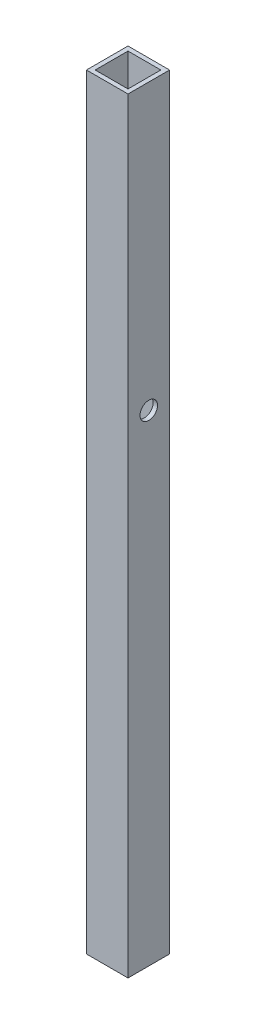
ISO-10303-21;
HEADER;
FILE_DESCRIPTION(('STEP AP214'),'2;1');
FILE_NAME('part.step','',(''),(''),'','','');
FILE_SCHEMA(('AUTOMOTIVE_DESIGN { 1 0 10303 214 1 1 1 1 }'));
ENDSEC;
DATA;
#1=APPLICATION_CONTEXT('core data for automotive mechanical design processes');
#2=APPLICATION_PROTOCOL_DEFINITION('international standard','automotive_design',2000,#1);
#3=PRODUCT_CONTEXT('',#1,'mechanical');
#4=PRODUCT('Part','Part','',(#3));
#5=PRODUCT_RELATED_PRODUCT_CATEGORY('part','',(#4));
#6=PRODUCT_DEFINITION_FORMATION('','',#4);
#7=PRODUCT_DEFINITION_CONTEXT('part definition',#1,'design');
#8=PRODUCT_DEFINITION('design','',#6,#7);
#9=PRODUCT_DEFINITION_SHAPE('','',#8);
#10=(LENGTH_UNIT() NAMED_UNIT(*) SI_UNIT(.MILLI.,.METRE.));
#11=(NAMED_UNIT(*) PLANE_ANGLE_UNIT() SI_UNIT($,.RADIAN.));
#12=(NAMED_UNIT(*) SI_UNIT($,.STERADIAN.) SOLID_ANGLE_UNIT());
#13=UNCERTAINTY_MEASURE_WITH_UNIT(LENGTH_MEASURE(1.E-05),#10,'distance_accuracy_value','');
#14=(GEOMETRIC_REPRESENTATION_CONTEXT(3) GLOBAL_UNCERTAINTY_ASSIGNED_CONTEXT((#13)) GLOBAL_UNIT_ASSIGNED_CONTEXT((#10,
#11,#12)) REPRESENTATION_CONTEXT('',''));
#15=CARTESIAN_POINT('',(0.,0.,0.));
#16=DIRECTION('',(0.,0.,1.));
#17=DIRECTION('',(1.,0.,0.));
#18=AXIS2_PLACEMENT_3D('',#15,#16,#17);
#19=CARTESIAN_POINT('',(0.,350.,0.));
#20=DIRECTION('',(0.,1.,0.));
#21=DIRECTION('',(0.,0.,1.));
#22=AXIS2_PLACEMENT_3D('',#19,#20,#21);
#23=PLANE('',#22);
#24=DIRECTION('',(0.,0.,-1.));
#25=VECTOR('',#24,1.);
#26=CARTESIAN_POINT('',(9.5,350.,9.5));
#27=LINE('',#26,#25);
#28=CARTESIAN_POINT('',(9.5,350.,9.5));
#29=VERTEX_POINT('',#28);
#30=CARTESIAN_POINT('',(9.5,350.,-9.5));
#31=VERTEX_POINT('',#30);
#32=EDGE_CURVE('E163',#29,#31,#27,.T.);
#33=ORIENTED_EDGE('',*,*,#32,.T.);
#34=DIRECTION('',(-1.,0.,0.));
#35=VECTOR('',#34,1.);
#36=CARTESIAN_POINT('',(-9.5,350.,-9.5));
#37=LINE('',#36,#35);
#38=CARTESIAN_POINT('',(-9.5,350.,-9.5));
#39=VERTEX_POINT('',#38);
#40=EDGE_CURVE('E166',#31,#39,#37,.T.);
#41=ORIENTED_EDGE('',*,*,#40,.T.);
#42=DIRECTION('',(0.,0.,1.));
#43=VECTOR('',#42,1.);
#44=CARTESIAN_POINT('',(-9.5,350.,9.5));
#45=LINE('',#44,#43);
#46=CARTESIAN_POINT('',(-9.5,350.,9.5));
#47=VERTEX_POINT('',#46);
#48=EDGE_CURVE('E169',#39,#47,#45,.T.);
#49=ORIENTED_EDGE('',*,*,#48,.T.);
#50=DIRECTION('',(1.,0.,0.));
#51=VECTOR('',#50,1.);
#52=CARTESIAN_POINT('',(-9.5,350.,9.5));
#53=LINE('',#52,#51);
#54=EDGE_CURVE('E171',#47,#29,#53,.T.);
#55=ORIENTED_EDGE('',*,*,#54,.T.);
#56=EDGE_LOOP('',(#33,#41,#49,#55));
#57=FACE_BOUND('',#56,.T.);
#58=DIRECTION('',(-1.,0.,0.));
#59=VECTOR('',#58,1.);
#60=CARTESIAN_POINT('',(0.,350.,-7.5));
#61=LINE('',#60,#59);
#62=CARTESIAN_POINT('',(7.5,350.,-7.5));
#63=VERTEX_POINT('',#62);
#64=CARTESIAN_POINT('',(-7.5,350.,-7.5));
#65=VERTEX_POINT('',#64);
#66=EDGE_CURVE('E134',#63,#65,#61,.T.);
#67=ORIENTED_EDGE('',*,*,#66,.F.);
#68=DIRECTION('',(0.,0.,-1.));
#69=VECTOR('',#68,1.);
#70=CARTESIAN_POINT('',(7.5,350.,0.));
#71=LINE('',#70,#69);
#72=CARTESIAN_POINT('',(7.5,350.,7.5));
#73=VERTEX_POINT('',#72);
#74=EDGE_CURVE('E126',#73,#63,#71,.T.);
#75=ORIENTED_EDGE('',*,*,#74,.F.);
#76=DIRECTION('',(1.,0.,0.));
#77=VECTOR('',#76,1.);
#78=CARTESIAN_POINT('',(0.,350.,7.5));
#79=LINE('',#78,#77);
#80=CARTESIAN_POINT('',(-7.5,350.,7.5));
#81=VERTEX_POINT('',#80);
#82=EDGE_CURVE('E148',#81,#73,#79,.T.);
#83=ORIENTED_EDGE('',*,*,#82,.F.);
#84=DIRECTION('',(0.,0.,1.));
#85=VECTOR('',#84,1.);
#86=CARTESIAN_POINT('',(-7.5,350.,0.));
#87=LINE('',#86,#85);
#88=EDGE_CURVE('E146',#65,#81,#87,.T.);
#89=ORIENTED_EDGE('',*,*,#88,.F.);
#90=EDGE_LOOP('',(#67,#75,#83,#89));
#91=FACE_BOUND('',#90,.T.);
#92=ADVANCED_FACE('F60',(#57,#91),#23,.T.);
#93=CARTESIAN_POINT('',(0.,0.,0.));
#94=DIRECTION('',(0.,1.,0.));
#95=DIRECTION('',(0.,0.,1.));
#96=AXIS2_PLACEMENT_3D('',#93,#94,#95);
#97=PLANE('',#96);
#98=DIRECTION('',(0.,0.,-1.));
#99=VECTOR('',#98,1.);
#100=CARTESIAN_POINT('',(9.5,0.,9.5));
#101=LINE('',#100,#99);
#102=CARTESIAN_POINT('',(9.5,0.,9.5));
#103=VERTEX_POINT('',#102);
#104=CARTESIAN_POINT('',(9.5,0.,-9.5));
#105=VERTEX_POINT('',#104);
#106=EDGE_CURVE('E142',#103,#105,#101,.T.);
#107=ORIENTED_EDGE('',*,*,#106,.F.);
#108=DIRECTION('',(1.,0.,0.));
#109=VECTOR('',#108,1.);
#110=CARTESIAN_POINT('',(-9.5,0.,9.5));
#111=LINE('',#110,#109);
#112=CARTESIAN_POINT('',(-9.5,0.,9.5));
#113=VERTEX_POINT('',#112);
#114=EDGE_CURVE('E167',#113,#103,#111,.T.);
#115=ORIENTED_EDGE('',*,*,#114,.F.);
#116=DIRECTION('',(0.,0.,1.));
#117=VECTOR('',#116,1.);
#118=CARTESIAN_POINT('',(-9.5,0.,9.5));
#119=LINE('',#118,#117);
#120=CARTESIAN_POINT('',(-9.5,0.,-9.5));
#121=VERTEX_POINT('',#120);
#122=EDGE_CURVE('E178',#121,#113,#119,.T.);
#123=ORIENTED_EDGE('',*,*,#122,.F.);
#124=DIRECTION('',(-1.,0.,0.));
#125=VECTOR('',#124,1.);
#126=CARTESIAN_POINT('',(-9.5,0.,-9.5));
#127=LINE('',#126,#125);
#128=EDGE_CURVE('E176',#105,#121,#127,.T.);
#129=ORIENTED_EDGE('',*,*,#128,.F.);
#130=EDGE_LOOP('',(#107,#115,#123,#129));
#131=FACE_BOUND('',#130,.T.);
#132=DIRECTION('',(0.,0.,-1.));
#133=VECTOR('',#132,1.);
#134=CARTESIAN_POINT('',(7.5,0.,0.));
#135=LINE('',#134,#133);
#136=CARTESIAN_POINT('',(7.5,0.,7.5));
#137=VERTEX_POINT('',#136);
#138=CARTESIAN_POINT('',(7.5,0.,-7.5));
#139=VERTEX_POINT('',#138);
#140=EDGE_CURVE('E84',#137,#139,#135,.T.);
#141=ORIENTED_EDGE('',*,*,#140,.T.);
#142=DIRECTION('',(-1.,0.,0.));
#143=VECTOR('',#142,1.);
#144=CARTESIAN_POINT('',(0.,0.,-7.5));
#145=LINE('',#144,#143);
#146=CARTESIAN_POINT('',(-7.5,0.,-7.5));
#147=VERTEX_POINT('',#146);
#148=EDGE_CURVE('E141',#139,#147,#145,.T.);
#149=ORIENTED_EDGE('',*,*,#148,.T.);
#150=DIRECTION('',(0.,0.,1.));
#151=VECTOR('',#150,1.);
#152=CARTESIAN_POINT('',(-7.5,0.,0.));
#153=LINE('',#152,#151);
#154=CARTESIAN_POINT('',(-7.5,0.,7.5));
#155=VERTEX_POINT('',#154);
#156=EDGE_CURVE('E155',#147,#155,#153,.T.);
#157=ORIENTED_EDGE('',*,*,#156,.T.);
#158=DIRECTION('',(1.,0.,0.));
#159=VECTOR('',#158,1.);
#160=CARTESIAN_POINT('',(0.,0.,7.5));
#161=LINE('',#160,#159);
#162=EDGE_CURVE('E135',#155,#137,#161,.T.);
#163=ORIENTED_EDGE('',*,*,#162,.T.);
#164=EDGE_LOOP('',(#141,#149,#157,#163));
#165=FACE_BOUND('',#164,.T.);
#166=ADVANCED_FACE('F197',(#131,#165),#97,.F.);
#167=CARTESIAN_POINT('',(9.5,350.,9.5));
#168=DIRECTION('',(-1.,0.,0.));
#169=DIRECTION('',(0.,0.,1.));
#170=AXIS2_PLACEMENT_3D('',#167,#168,#169);
#171=PLANE('',#170);
#172=CARTESIAN_POINT('',(9.5,220.,0.));
#173=DIRECTION('',(1.,0.,0.));
#174=DIRECTION('',(0.,0.,-1.));
#175=AXIS2_PLACEMENT_3D('',#172,#173,#174);
#176=CIRCLE('',#175,4.);
#177=CARTESIAN_POINT('',(9.5,220.,-4.));
#178=VERTEX_POINT('',#177);
#179=EDGE_CURVE('E236',#178,#178,#176,.T.);
#180=ORIENTED_EDGE('',*,*,#179,.F.);
#181=EDGE_LOOP('',(#180));
#182=FACE_BOUND('',#181,.T.);
#183=ORIENTED_EDGE('',*,*,#106,.T.);
#184=DIRECTION('',(0.,-1.,0.));
#185=VECTOR('',#184,1.);
#186=CARTESIAN_POINT('',(9.5,350.,-9.5));
#187=LINE('',#186,#185);
#188=EDGE_CURVE('E12',#31,#105,#187,.T.);
#189=ORIENTED_EDGE('',*,*,#188,.F.);
#190=ORIENTED_EDGE('',*,*,#32,.F.);
#191=DIRECTION('',(0.,-1.,0.));
#192=VECTOR('',#191,1.);
#193=CARTESIAN_POINT('',(9.5,350.,9.5));
#194=LINE('',#193,#192);
#195=EDGE_CURVE('E173',#29,#103,#194,.T.);
#196=ORIENTED_EDGE('',*,*,#195,.T.);
#197=EDGE_LOOP('',(#183,#189,#190,#196));
#198=FACE_BOUND('',#197,.T.);
#199=ADVANCED_FACE('F62',(#182,#198),#171,.F.);
#200=CARTESIAN_POINT('',(-9.5,350.,-9.5));
#201=DIRECTION('',(0.,0.,1.));
#202=DIRECTION('',(1.,0.,0.));
#203=AXIS2_PLACEMENT_3D('',#200,#201,#202);
#204=PLANE('',#203);
#205=ORIENTED_EDGE('',*,*,#128,.T.);
#206=DIRECTION('',(0.,-1.,0.));
#207=VECTOR('',#206,1.);
#208=CARTESIAN_POINT('',(-9.5,350.,-9.5));
#209=LINE('',#208,#207);
#210=EDGE_CURVE('E69',#39,#121,#209,.T.);
#211=ORIENTED_EDGE('',*,*,#210,.F.);
#212=ORIENTED_EDGE('',*,*,#40,.F.);
#213=ORIENTED_EDGE('',*,*,#188,.T.);
#214=EDGE_LOOP('',(#205,#211,#212,#213));
#215=FACE_BOUND('',#214,.T.);
#216=ADVANCED_FACE('F207',(#215),#204,.F.);
#217=CARTESIAN_POINT('',(-9.5,350.,9.5));
#218=DIRECTION('',(1.,0.,0.));
#219=DIRECTION('',(0.,0.,-1.));
#220=AXIS2_PLACEMENT_3D('',#217,#218,#219);
#221=PLANE('',#220);
#222=ORIENTED_EDGE('',*,*,#122,.T.);
#223=DIRECTION('',(0.,-1.,0.));
#224=VECTOR('',#223,1.);
#225=CARTESIAN_POINT('',(-9.5,350.,9.5));
#226=LINE('',#225,#224);
#227=EDGE_CURVE('E183',#47,#113,#226,.T.);
#228=ORIENTED_EDGE('',*,*,#227,.F.);
#229=ORIENTED_EDGE('',*,*,#48,.F.);
#230=ORIENTED_EDGE('',*,*,#210,.T.);
#231=EDGE_LOOP('',(#222,#228,#229,#230));
#232=FACE_BOUND('',#231,.T.);
#233=ADVANCED_FACE('F191',(#232),#221,.F.);
#234=CARTESIAN_POINT('',(-9.5,350.,9.5));
#235=DIRECTION('',(0.,0.,-1.));
#236=DIRECTION('',(-1.,0.,0.));
#237=AXIS2_PLACEMENT_3D('',#234,#235,#236);
#238=PLANE('',#237);
#239=ORIENTED_EDGE('',*,*,#114,.T.);
#240=ORIENTED_EDGE('',*,*,#195,.F.);
#241=ORIENTED_EDGE('',*,*,#54,.F.);
#242=ORIENTED_EDGE('',*,*,#227,.T.);
#243=EDGE_LOOP('',(#239,#240,#241,#242));
#244=FACE_BOUND('',#243,.T.);
#245=ADVANCED_FACE('F201',(#244),#238,.F.);
#246=CARTESIAN_POINT('',(7.5,350.,0.));
#247=DIRECTION('',(-1.,0.,0.));
#248=DIRECTION('',(0.,0.,1.));
#249=AXIS2_PLACEMENT_3D('',#246,#247,#248);
#250=PLANE('',#249);
#251=CARTESIAN_POINT('',(7.5,220.,0.));
#252=DIRECTION('',(-1.,0.,0.));
#253=DIRECTION('',(0.,0.,1.));
#254=AXIS2_PLACEMENT_3D('',#251,#252,#253);
#255=CIRCLE('',#254,4.);
#256=CARTESIAN_POINT('',(7.5,220.,4.));
#257=VERTEX_POINT('',#256);
#258=EDGE_CURVE('E64',#257,#257,#255,.T.);
#259=ORIENTED_EDGE('',*,*,#258,.F.);
#260=EDGE_LOOP('',(#259));
#261=FACE_BOUND('',#260,.T.);
#262=ORIENTED_EDGE('',*,*,#140,.F.);
#263=DIRECTION('',(0.,-1.,0.));
#264=VECTOR('',#263,1.);
#265=CARTESIAN_POINT('',(7.5,350.,7.5));
#266=LINE('',#265,#264);
#267=EDGE_CURVE('E130',#73,#137,#266,.T.);
#268=ORIENTED_EDGE('',*,*,#267,.F.);
#269=ORIENTED_EDGE('',*,*,#74,.T.);
#270=DIRECTION('',(0.,-1.,0.));
#271=VECTOR('',#270,1.);
#272=CARTESIAN_POINT('',(7.5,350.,-7.5));
#273=LINE('',#272,#271);
#274=EDGE_CURVE('E129',#63,#139,#273,.T.);
#275=ORIENTED_EDGE('',*,*,#274,.T.);
#276=EDGE_LOOP('',(#262,#268,#269,#275));
#277=FACE_BOUND('',#276,.T.);
#278=ADVANCED_FACE('F128',(#261,#277),#250,.T.);
#279=CARTESIAN_POINT('',(0.,350.,-7.5));
#280=DIRECTION('',(0.,0.,1.));
#281=DIRECTION('',(1.,0.,0.));
#282=AXIS2_PLACEMENT_3D('',#279,#280,#281);
#283=PLANE('',#282);
#284=ORIENTED_EDGE('',*,*,#148,.F.);
#285=ORIENTED_EDGE('',*,*,#274,.F.);
#286=ORIENTED_EDGE('',*,*,#66,.T.);
#287=DIRECTION('',(0.,-1.,0.));
#288=VECTOR('',#287,1.);
#289=CARTESIAN_POINT('',(-7.5,350.,-7.5));
#290=LINE('',#289,#288);
#291=EDGE_CURVE('E143',#65,#147,#290,.T.);
#292=ORIENTED_EDGE('',*,*,#291,.T.);
#293=EDGE_LOOP('',(#284,#285,#286,#292));
#294=FACE_BOUND('',#293,.T.);
#295=ADVANCED_FACE('F138',(#294),#283,.T.);
#296=CARTESIAN_POINT('',(-7.5,350.,0.));
#297=DIRECTION('',(1.,0.,0.));
#298=DIRECTION('',(0.,0.,-1.));
#299=AXIS2_PLACEMENT_3D('',#296,#297,#298);
#300=PLANE('',#299);
#301=ORIENTED_EDGE('',*,*,#156,.F.);
#302=ORIENTED_EDGE('',*,*,#291,.F.);
#303=ORIENTED_EDGE('',*,*,#88,.T.);
#304=DIRECTION('',(0.,-1.,0.));
#305=VECTOR('',#304,1.);
#306=CARTESIAN_POINT('',(-7.5,350.,7.5));
#307=LINE('',#306,#305);
#308=EDGE_CURVE('E76',#81,#155,#307,.T.);
#309=ORIENTED_EDGE('',*,*,#308,.T.);
#310=EDGE_LOOP('',(#301,#302,#303,#309));
#311=FACE_BOUND('',#310,.T.);
#312=ADVANCED_FACE('F232',(#311),#300,.T.);
#313=CARTESIAN_POINT('',(0.,350.,7.5));
#314=DIRECTION('',(0.,0.,-1.));
#315=DIRECTION('',(-1.,0.,0.));
#316=AXIS2_PLACEMENT_3D('',#313,#314,#315);
#317=PLANE('',#316);
#318=ORIENTED_EDGE('',*,*,#162,.F.);
#319=ORIENTED_EDGE('',*,*,#308,.F.);
#320=ORIENTED_EDGE('',*,*,#82,.T.);
#321=ORIENTED_EDGE('',*,*,#267,.T.);
#322=EDGE_LOOP('',(#318,#319,#320,#321));
#323=FACE_BOUND('',#322,.T.);
#324=ADVANCED_FACE('F242',(#323),#317,.T.);
#325=CARTESIAN_POINT('',(5.5,220.,0.));
#326=DIRECTION('',(1.,0.,0.));
#327=DIRECTION('',(0.,0.,-1.));
#328=AXIS2_PLACEMENT_3D('',#325,#326,#327);
#329=CYLINDRICAL_SURFACE('',#328,4.);
#330=ORIENTED_EDGE('',*,*,#258,.T.);
#331=EDGE_LOOP('',(#330));
#332=FACE_BOUND('',#331,.T.);
#333=ORIENTED_EDGE('',*,*,#179,.T.);
#334=EDGE_LOOP('',(#333));
#335=FACE_BOUND('',#334,.T.);
#336=ADVANCED_FACE('F240',(#332,#335),#329,.F.);
#337=CLOSED_SHELL('',(#92,#166,#199,#216,#233,#245,#278,#295,#312,#324,#336));
#338=MANIFOLD_SOLID_BREP('B2',#337);
#339=ADVANCED_BREP_SHAPE_REPRESENTATION('',(#18,#338),#14);
#340=SHAPE_DEFINITION_REPRESENTATION(#9,#339);
ENDSEC;
END-ISO-10303-21;
